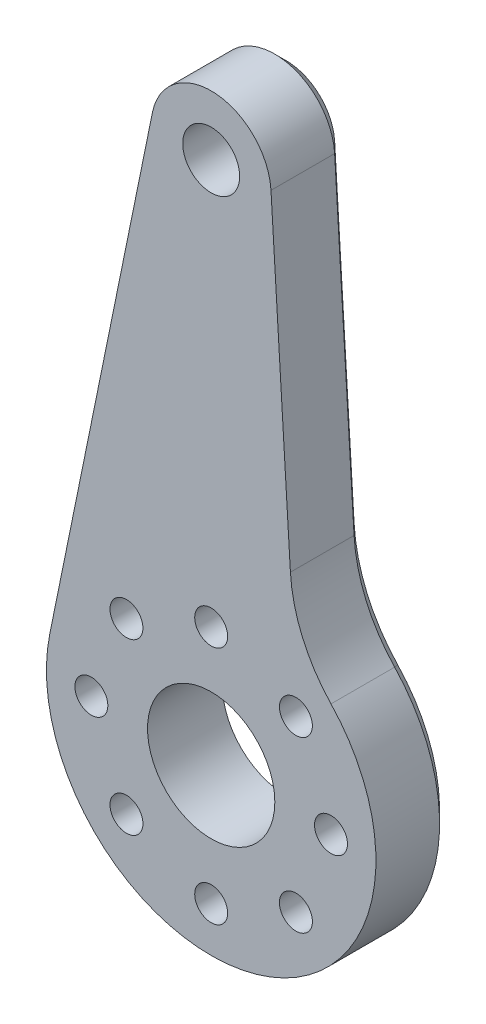
ISO-10303-21;
HEADER;
FILE_DESCRIPTION(('STEP AP214'),'2;1');
FILE_NAME('part.step','',(''),(''),'','','');
FILE_SCHEMA(('AUTOMOTIVE_DESIGN { 1 0 10303 214 1 1 1 1 }'));
ENDSEC;
DATA;
#1=APPLICATION_CONTEXT('core data for automotive mechanical design processes');
#2=APPLICATION_PROTOCOL_DEFINITION('international standard','automotive_design',2000,#1);
#3=PRODUCT_CONTEXT('',#1,'mechanical');
#4=PRODUCT('Part','Part','',(#3));
#5=PRODUCT_RELATED_PRODUCT_CATEGORY('part','',(#4));
#6=PRODUCT_DEFINITION_FORMATION('','',#4);
#7=PRODUCT_DEFINITION_CONTEXT('part definition',#1,'design');
#8=PRODUCT_DEFINITION('design','',#6,#7);
#9=PRODUCT_DEFINITION_SHAPE('','',#8);
#10=(LENGTH_UNIT() NAMED_UNIT(*) SI_UNIT(.MILLI.,.METRE.));
#11=(NAMED_UNIT(*) PLANE_ANGLE_UNIT() SI_UNIT($,.RADIAN.));
#12=(NAMED_UNIT(*) SI_UNIT($,.STERADIAN.) SOLID_ANGLE_UNIT());
#13=UNCERTAINTY_MEASURE_WITH_UNIT(LENGTH_MEASURE(1.E-05),#10,'distance_accuracy_value','');
#14=(GEOMETRIC_REPRESENTATION_CONTEXT(3) GLOBAL_UNCERTAINTY_ASSIGNED_CONTEXT((#13)) GLOBAL_UNIT_ASSIGNED_CONTEXT((#10,
#11,#12)) REPRESENTATION_CONTEXT('',''));
#15=CARTESIAN_POINT('',(0.,0.,0.));
#16=DIRECTION('',(0.,0.,1.));
#17=DIRECTION('',(1.,0.,0.));
#18=AXIS2_PLACEMENT_3D('',#15,#16,#17);
#19=CARTESIAN_POINT('',(-6.935866144815,-20.6239036018759,5.));
#20=DIRECTION('',(0.,0.,-1.));
#21=DIRECTION('',(-1.,0.,0.));
#22=AXIS2_PLACEMENT_3D('',#19,#20,#21);
#23=CYLINDRICAL_SURFACE('',#22,1.1);
#24=CARTESIAN_POINT('',(-6.935866144815,-20.6239036018759,5.));
#25=DIRECTION('',(0.,0.,1.));
#26=DIRECTION('',(1.,0.,0.));
#27=AXIS2_PLACEMENT_3D('',#24,#25,#26);
#28=CIRCLE('',#27,1.1);
#29=CARTESIAN_POINT('',(-5.835866144815,-20.6239036018759,5.));
#30=VERTEX_POINT('',#29);
#31=EDGE_CURVE('E227',#30,#30,#28,.T.);
#32=ORIENTED_EDGE('',*,*,#31,.T.);
#33=EDGE_LOOP('',(#32));
#34=FACE_BOUND('',#33,.T.);
#35=CARTESIAN_POINT('',(-6.935866144815,-20.6239036018759,2.25));
#36=DIRECTION('',(0.,0.,-1.));
#37=DIRECTION('',(-1.,0.,0.));
#38=AXIS2_PLACEMENT_3D('',#35,#36,#37);
#39=CIRCLE('',#38,1.1);
#40=CARTESIAN_POINT('',(-8.035866144815,-20.6239036018759,2.25));
#41=VERTEX_POINT('',#40);
#42=EDGE_CURVE('E203',#41,#41,#39,.T.);
#43=ORIENTED_EDGE('',*,*,#42,.T.);
#44=EDGE_LOOP('',(#43));
#45=FACE_BOUND('',#44,.T.);
#46=ADVANCED_FACE('F39',(#34,#45),#23,.F.);
#47=CARTESIAN_POINT('',(-9.27901189532261,-26.2807578513683,5.));
#48=DIRECTION('',(0.,0.,-1.));
#49=DIRECTION('',(-1.,0.,0.));
#50=AXIS2_PLACEMENT_3D('',#47,#48,#49);
#51=CYLINDRICAL_SURFACE('',#50,1.1);
#52=CARTESIAN_POINT('',(-9.27901189532261,-26.2807578513683,5.));
#53=DIRECTION('',(0.,0.,1.));
#54=DIRECTION('',(1.,0.,0.));
#55=AXIS2_PLACEMENT_3D('',#52,#53,#54);
#56=CIRCLE('',#55,1.1);
#57=CARTESIAN_POINT('',(-8.17901189532261,-26.2807578513683,5.));
#58=VERTEX_POINT('',#57);
#59=EDGE_CURVE('E223',#58,#58,#56,.T.);
#60=ORIENTED_EDGE('',*,*,#59,.T.);
#61=EDGE_LOOP('',(#60));
#62=FACE_BOUND('',#61,.T.);
#63=CARTESIAN_POINT('',(-9.27901189532261,-26.2807578513683,2.25));
#64=DIRECTION('',(0.,0.,-1.));
#65=DIRECTION('',(-1.,0.,0.));
#66=AXIS2_PLACEMENT_3D('',#63,#64,#65);
#67=CIRCLE('',#66,1.1);
#68=CARTESIAN_POINT('',(-10.3790118953226,-26.2807578513683,2.25));
#69=VERTEX_POINT('',#68);
#70=EDGE_CURVE('E280',#69,#69,#67,.T.);
#71=ORIENTED_EDGE('',*,*,#70,.T.);
#72=EDGE_LOOP('',(#71));
#73=FACE_BOUND('',#72,.T.);
#74=ADVANCED_FACE('F402',(#62,#73),#51,.F.);
#75=CARTESIAN_POINT('',(-14.935866144815,-28.6239036018759,5.));
#76=DIRECTION('',(0.,0.,-1.));
#77=DIRECTION('',(-1.,0.,0.));
#78=AXIS2_PLACEMENT_3D('',#75,#76,#77);
#79=CYLINDRICAL_SURFACE('',#78,1.1);
#80=CARTESIAN_POINT('',(-14.935866144815,-28.6239036018759,5.));
#81=DIRECTION('',(0.,0.,1.));
#82=DIRECTION('',(1.,0.,0.));
#83=AXIS2_PLACEMENT_3D('',#80,#81,#82);
#84=CIRCLE('',#83,1.1);
#85=CARTESIAN_POINT('',(-13.835866144815,-28.6239036018759,5.));
#86=VERTEX_POINT('',#85);
#87=EDGE_CURVE('E219',#86,#86,#84,.T.);
#88=ORIENTED_EDGE('',*,*,#87,.T.);
#89=EDGE_LOOP('',(#88));
#90=FACE_BOUND('',#89,.T.);
#91=CARTESIAN_POINT('',(-14.935866144815,-28.6239036018759,2.25));
#92=DIRECTION('',(0.,0.,-1.));
#93=DIRECTION('',(-1.,0.,0.));
#94=AXIS2_PLACEMENT_3D('',#91,#92,#93);
#95=CIRCLE('',#94,1.1);
#96=CARTESIAN_POINT('',(-16.035866144815,-28.6239036018759,2.25));
#97=VERTEX_POINT('',#96);
#98=EDGE_CURVE('E276',#97,#97,#95,.T.);
#99=ORIENTED_EDGE('',*,*,#98,.T.);
#100=EDGE_LOOP('',(#99));
#101=FACE_BOUND('',#100,.T.);
#102=ADVANCED_FACE('F407',(#90,#101),#79,.F.);
#103=CARTESIAN_POINT('',(-20.5927203943074,-26.2807578513683,5.));
#104=DIRECTION('',(0.,0.,-1.));
#105=DIRECTION('',(-1.,0.,0.));
#106=AXIS2_PLACEMENT_3D('',#103,#104,#105);
#107=CYLINDRICAL_SURFACE('',#106,1.1);
#108=CARTESIAN_POINT('',(-20.5927203943074,-26.2807578513683,5.));
#109=DIRECTION('',(0.,0.,1.));
#110=DIRECTION('',(1.,0.,0.));
#111=AXIS2_PLACEMENT_3D('',#108,#109,#110);
#112=CIRCLE('',#111,1.1);
#113=CARTESIAN_POINT('',(-19.4927203943074,-26.2807578513683,5.));
#114=VERTEX_POINT('',#113);
#115=EDGE_CURVE('E215',#114,#114,#112,.T.);
#116=ORIENTED_EDGE('',*,*,#115,.T.);
#117=EDGE_LOOP('',(#116));
#118=FACE_BOUND('',#117,.T.);
#119=CARTESIAN_POINT('',(-20.5927203943074,-26.2807578513683,2.25));
#120=DIRECTION('',(0.,0.,-1.));
#121=DIRECTION('',(-1.,0.,0.));
#122=AXIS2_PLACEMENT_3D('',#119,#120,#121);
#123=CIRCLE('',#122,1.1);
#124=CARTESIAN_POINT('',(-21.6927203943074,-26.2807578513683,2.25));
#125=VERTEX_POINT('',#124);
#126=EDGE_CURVE('E272',#125,#125,#123,.T.);
#127=ORIENTED_EDGE('',*,*,#126,.T.);
#128=EDGE_LOOP('',(#127));
#129=FACE_BOUND('',#128,.T.);
#130=ADVANCED_FACE('F414',(#118,#129),#107,.F.);
#131=CARTESIAN_POINT('',(-22.935866144815,-20.6239036018759,5.));
#132=DIRECTION('',(0.,0.,-1.));
#133=DIRECTION('',(-1.,0.,0.));
#134=AXIS2_PLACEMENT_3D('',#131,#132,#133);
#135=CYLINDRICAL_SURFACE('',#134,1.1);
#136=CARTESIAN_POINT('',(-22.935866144815,-20.6239036018759,5.));
#137=DIRECTION('',(0.,0.,1.));
#138=DIRECTION('',(1.,0.,0.));
#139=AXIS2_PLACEMENT_3D('',#136,#137,#138);
#140=CIRCLE('',#139,1.1);
#141=CARTESIAN_POINT('',(-21.835866144815,-20.6239036018759,5.));
#142=VERTEX_POINT('',#141);
#143=EDGE_CURVE('E211',#142,#142,#140,.T.);
#144=ORIENTED_EDGE('',*,*,#143,.T.);
#145=EDGE_LOOP('',(#144));
#146=FACE_BOUND('',#145,.T.);
#147=CARTESIAN_POINT('',(-22.935866144815,-20.6239036018759,2.25));
#148=DIRECTION('',(0.,0.,-1.));
#149=DIRECTION('',(-1.,0.,0.));
#150=AXIS2_PLACEMENT_3D('',#147,#148,#149);
#151=CIRCLE('',#150,1.1);
#152=CARTESIAN_POINT('',(-24.035866144815,-20.6239036018759,2.25));
#153=VERTEX_POINT('',#152);
#154=EDGE_CURVE('E268',#153,#153,#151,.T.);
#155=ORIENTED_EDGE('',*,*,#154,.T.);
#156=EDGE_LOOP('',(#155));
#157=FACE_BOUND('',#156,.T.);
#158=ADVANCED_FACE('F418',(#146,#157),#135,.F.);
#159=CARTESIAN_POINT('',(-20.5927203943074,-14.9670493523836,5.));
#160=DIRECTION('',(0.,0.,-1.));
#161=DIRECTION('',(-1.,0.,0.));
#162=AXIS2_PLACEMENT_3D('',#159,#160,#161);
#163=CYLINDRICAL_SURFACE('',#162,1.1);
#164=CARTESIAN_POINT('',(-20.5927203943074,-14.9670493523836,5.));
#165=DIRECTION('',(0.,0.,1.));
#166=DIRECTION('',(1.,0.,0.));
#167=AXIS2_PLACEMENT_3D('',#164,#165,#166);
#168=CIRCLE('',#167,1.1);
#169=CARTESIAN_POINT('',(-19.4927203943074,-14.9670493523836,5.));
#170=VERTEX_POINT('',#169);
#171=EDGE_CURVE('E207',#170,#170,#168,.T.);
#172=ORIENTED_EDGE('',*,*,#171,.T.);
#173=EDGE_LOOP('',(#172));
#174=FACE_BOUND('',#173,.T.);
#175=CARTESIAN_POINT('',(-20.5927203943074,-14.9670493523836,2.25));
#176=DIRECTION('',(0.,0.,-1.));
#177=DIRECTION('',(-1.,0.,0.));
#178=AXIS2_PLACEMENT_3D('',#175,#176,#177);
#179=CIRCLE('',#178,1.1);
#180=CARTESIAN_POINT('',(-21.6927203943074,-14.9670493523836,2.25));
#181=VERTEX_POINT('',#180);
#182=EDGE_CURVE('E264',#181,#181,#179,.T.);
#183=ORIENTED_EDGE('',*,*,#182,.T.);
#184=EDGE_LOOP('',(#183));
#185=FACE_BOUND('',#184,.T.);
#186=ADVANCED_FACE('F422',(#174,#185),#163,.F.);
#187=CARTESIAN_POINT('',(-14.935866144815,-12.6239036018759,5.));
#188=DIRECTION('',(0.,0.,-1.));
#189=DIRECTION('',(-1.,0.,0.));
#190=AXIS2_PLACEMENT_3D('',#187,#188,#189);
#191=CYLINDRICAL_SURFACE('',#190,1.1);
#192=CARTESIAN_POINT('',(-14.935866144815,-12.6239036018759,5.));
#193=DIRECTION('',(0.,0.,1.));
#194=DIRECTION('',(1.,0.,0.));
#195=AXIS2_PLACEMENT_3D('',#192,#193,#194);
#196=CIRCLE('',#195,1.1);
#197=CARTESIAN_POINT('',(-13.835866144815,-12.6239036018759,5.));
#198=VERTEX_POINT('',#197);
#199=EDGE_CURVE('E202',#198,#198,#196,.T.);
#200=ORIENTED_EDGE('',*,*,#199,.T.);
#201=EDGE_LOOP('',(#200));
#202=FACE_BOUND('',#201,.T.);
#203=CARTESIAN_POINT('',(-14.935866144815,-12.6239036018759,2.25));
#204=DIRECTION('',(0.,0.,-1.));
#205=DIRECTION('',(-1.,0.,0.));
#206=AXIS2_PLACEMENT_3D('',#203,#204,#205);
#207=CIRCLE('',#206,1.1);
#208=CARTESIAN_POINT('',(-16.035866144815,-12.6239036018759,2.25));
#209=VERTEX_POINT('',#208);
#210=EDGE_CURVE('E260',#209,#209,#207,.T.);
#211=ORIENTED_EDGE('',*,*,#210,.T.);
#212=EDGE_LOOP('',(#211));
#213=FACE_BOUND('',#212,.T.);
#214=ADVANCED_FACE('F426',(#202,#213),#191,.F.);
#215=CARTESIAN_POINT('',(-9.27901189532263,-14.9670493523835,5.));
#216=DIRECTION('',(0.,0.,-1.));
#217=DIRECTION('',(-1.,0.,0.));
#218=AXIS2_PLACEMENT_3D('',#215,#216,#217);
#219=CYLINDRICAL_SURFACE('',#218,1.1);
#220=CARTESIAN_POINT('',(-9.27901189532263,-14.9670493523835,5.));
#221=DIRECTION('',(0.,0.,1.));
#222=DIRECTION('',(1.,0.,0.));
#223=AXIS2_PLACEMENT_3D('',#220,#221,#222);
#224=CIRCLE('',#223,1.1);
#225=CARTESIAN_POINT('',(-8.17901189532263,-14.9670493523835,5.));
#226=VERTEX_POINT('',#225);
#227=EDGE_CURVE('E198',#226,#226,#224,.T.);
#228=ORIENTED_EDGE('',*,*,#227,.T.);
#229=EDGE_LOOP('',(#228));
#230=FACE_BOUND('',#229,.T.);
#231=CARTESIAN_POINT('',(-9.27901189532263,-14.9670493523835,2.25));
#232=DIRECTION('',(0.,0.,-1.));
#233=DIRECTION('',(-1.,0.,0.));
#234=AXIS2_PLACEMENT_3D('',#231,#232,#233);
#235=CIRCLE('',#234,1.1);
#236=CARTESIAN_POINT('',(-10.3790118953226,-14.9670493523835,2.25));
#237=VERTEX_POINT('',#236);
#238=EDGE_CURVE('E194',#237,#237,#235,.T.);
#239=ORIENTED_EDGE('',*,*,#238,.T.);
#240=EDGE_LOOP('',(#239));
#241=FACE_BOUND('',#240,.T.);
#242=ADVANCED_FACE('F430',(#230,#241),#219,.F.);
#243=CARTESIAN_POINT('',(-14.935866144815,14.3760963981241,5.));
#244=DIRECTION('',(0.,0.,1.));
#245=DIRECTION('',(1.,0.,0.));
#246=AXIS2_PLACEMENT_3D('',#243,#244,#245);
#247=PLANE('',#246);
#248=DIRECTION('',(0.0604046732284117,-0.99817397053428,0.));
#249=VECTOR('',#248,1.);
#250=CARTESIAN_POINT('',(-10.9431702626779,14.6177150910377,5.));
#251=LINE('',#250,#249);
#252=CARTESIAN_POINT('',(-10.9431702626779,14.6177150910377,5.));
#253=VERTEX_POINT('',#252);
#254=CARTESIAN_POINT('',(-9.64627784771592,-6.81314748979778,5.));
#255=VERTEX_POINT('',#254);
#256=EDGE_CURVE('E119',#253,#255,#251,.T.);
#257=ORIENTED_EDGE('',*,*,#256,.F.);
#258=CARTESIAN_POINT('',(-14.935866144815,14.3760963981241,5.));
#259=DIRECTION('',(0.,0.,1.));
#260=DIRECTION('',(1.,0.,0.));
#261=AXIS2_PLACEMENT_3D('',#258,#259,#260);
#262=CIRCLE('',#261,4.);
#263=CARTESIAN_POINT('',(-18.8550497332681,15.1760963981241,5.));
#264=VERTEX_POINT('',#263);
#265=EDGE_CURVE('E103',#253,#264,#262,.T.);
#266=ORIENTED_EDGE('',*,*,#265,.T.);
#267=DIRECTION('',(-0.2,-0.979795897113271,0.));
#268=VECTOR('',#267,1.);
#269=CARTESIAN_POINT('',(-18.8550497332681,15.1760963981241,5.));
#270=LINE('',#269,#268);
#271=CARTESIAN_POINT('',(-25.713621013061,-18.4239036018759,5.));
#272=VERTEX_POINT('',#271);
#273=EDGE_CURVE('E111',#264,#272,#270,.T.);
#274=ORIENTED_EDGE('',*,*,#273,.T.);
#275=CARTESIAN_POINT('',(-14.935866144815,-20.6239036018759,5.));
#276=DIRECTION('',(0.,0.,1.));
#277=DIRECTION('',(1.,0.,0.));
#278=AXIS2_PLACEMENT_3D('',#275,#276,#277);
#279=CIRCLE('',#278,11.);
#280=CARTESIAN_POINT('',(-6.93659909591687,-13.0732925881624,5.));
#281=VERTEX_POINT('',#280);
#282=EDGE_CURVE('E248',#272,#281,#279,.T.);
#283=ORIENTED_EDGE('',*,*,#282,.T.);
#284=CARTESIAN_POINT('',(0.335461857626873,-6.20910075751366,5.));
#285=DIRECTION('',(0.,0.,1.));
#286=DIRECTION('',(1.,0.,0.));
#287=AXIS2_PLACEMENT_3D('',#284,#285,#286);
#288=CIRCLE('',#287,10.);
#289=EDGE_CURVE('E129',#281,#255,#288,.F.);
#290=ORIENTED_EDGE('',*,*,#289,.T.);
#291=EDGE_LOOP('',(#257,#266,#274,#283,#290));
#292=FACE_BOUND('',#291,.T.);
#293=ORIENTED_EDGE('',*,*,#199,.F.);
#294=EDGE_LOOP('',(#293));
#295=FACE_BOUND('',#294,.T.);
#296=ORIENTED_EDGE('',*,*,#143,.F.);
#297=EDGE_LOOP('',(#296));
#298=FACE_BOUND('',#297,.T.);
#299=ORIENTED_EDGE('',*,*,#87,.F.);
#300=EDGE_LOOP('',(#299));
#301=FACE_BOUND('',#300,.T.);
#302=ORIENTED_EDGE('',*,*,#31,.F.);
#303=EDGE_LOOP('',(#302));
#304=FACE_BOUND('',#303,.T.);
#305=CARTESIAN_POINT('',(-14.935866144815,14.3760963981241,5.));
#306=DIRECTION('',(0.,0.,1.));
#307=DIRECTION('',(1.,0.,0.));
#308=AXIS2_PLACEMENT_3D('',#305,#306,#307);
#309=CIRCLE('',#308,1.9);
#310=CARTESIAN_POINT('',(-13.035866144815,14.3760963981241,5.));
#311=VERTEX_POINT('',#310);
#312=EDGE_CURVE('E112',#311,#311,#309,.T.);
#313=ORIENTED_EDGE('',*,*,#312,.F.);
#314=EDGE_LOOP('',(#313));
#315=FACE_BOUND('',#314,.T.);
#316=CARTESIAN_POINT('',(-14.935866144815,-20.6239036018759,5.));
#317=DIRECTION('',(0.,0.,1.));
#318=DIRECTION('',(1.,0.,0.));
#319=AXIS2_PLACEMENT_3D('',#316,#317,#318);
#320=CIRCLE('',#319,4.25);
#321=CARTESIAN_POINT('',(-10.685866144815,-20.6239036018759,5.));
#322=VERTEX_POINT('',#321);
#323=EDGE_CURVE('E232',#322,#322,#320,.T.);
#324=ORIENTED_EDGE('',*,*,#323,.F.);
#325=EDGE_LOOP('',(#324));
#326=FACE_BOUND('',#325,.T.);
#327=ORIENTED_EDGE('',*,*,#59,.F.);
#328=EDGE_LOOP('',(#327));
#329=FACE_BOUND('',#328,.T.);
#330=ORIENTED_EDGE('',*,*,#115,.F.);
#331=EDGE_LOOP('',(#330));
#332=FACE_BOUND('',#331,.T.);
#333=ORIENTED_EDGE('',*,*,#171,.F.);
#334=EDGE_LOOP('',(#333));
#335=FACE_BOUND('',#334,.T.);
#336=ORIENTED_EDGE('',*,*,#227,.F.);
#337=EDGE_LOOP('',(#336));
#338=FACE_BOUND('',#337,.T.);
#339=ADVANCED_FACE('F125',(#292,#295,#298,#301,#304,#315,#326,#329,#332,#335,#338),#247,.T.);
#340=CARTESIAN_POINT('',(-14.935866144815,14.3760963981241,0.));
#341=DIRECTION('',(0.,0.,1.));
#342=DIRECTION('',(1.,0.,0.));
#343=AXIS2_PLACEMENT_3D('',#340,#341,#342);
#344=PLANE('',#343);
#345=CARTESIAN_POINT('',(-14.935866144815,14.3760963981241,0.));
#346=DIRECTION('',(0.,0.,1.));
#347=DIRECTION('',(1.,0.,0.));
#348=AXIS2_PLACEMENT_3D('',#345,#346,#347);
#349=CIRCLE('',#348,3.25000000000001);
#350=CARTESIAN_POINT('',(-18.1202028104331,15.0260963981241,0.));
#351=VERTEX_POINT('',#350);
#352=CARTESIAN_POINT('',(-11.6918007405786,14.5724115861164,0.));
#353=VERTEX_POINT('',#352);
#354=EDGE_CURVE('E302',#351,#353,#349,.F.);
#355=ORIENTED_EDGE('',*,*,#354,.T.);
#356=DIRECTION('',(0.0604046732284117,-0.99817397053428,0.));
#357=VECTOR('',#356,1.);
#358=CARTESIAN_POINT('',(-11.6918007405786,14.5724115861164,0.));
#359=LINE('',#358,#357);
#360=CARTESIAN_POINT('',(-10.3949083256166,-6.85845099471908,0.));
#361=VERTEX_POINT('',#360);
#362=EDGE_CURVE('E308',#353,#361,#359,.T.);
#363=ORIENTED_EDGE('',*,*,#362,.T.);
#364=CARTESIAN_POINT('',(0.335461857626873,-6.20910075751366,0.));
#365=DIRECTION('',(0.,0.,1.));
#366=DIRECTION('',(1.,0.,0.));
#367=AXIS2_PLACEMENT_3D('',#364,#365,#366);
#368=CIRCLE('',#367,10.75);
#369=CARTESIAN_POINT('',(-7.48200366743265,-13.588106975461,0.));
#370=VERTEX_POINT('',#369);
#371=EDGE_CURVE('E305',#361,#370,#368,.T.);
#372=ORIENTED_EDGE('',*,*,#371,.T.);
#373=CARTESIAN_POINT('',(-14.935866144815,-20.6239036018759,0.));
#374=DIRECTION('',(0.,0.,1.));
#375=DIRECTION('',(1.,0.,0.));
#376=AXIS2_PLACEMENT_3D('',#373,#374,#375);
#377=CIRCLE('',#376,10.25);
#378=CARTESIAN_POINT('',(-24.978774090226,-18.5739036018759,0.));
#379=VERTEX_POINT('',#378);
#380=EDGE_CURVE('E299',#370,#379,#377,.F.);
#381=ORIENTED_EDGE('',*,*,#380,.T.);
#382=DIRECTION('',(0.2,0.979795897113271,0.));
#383=VECTOR('',#382,1.);
#384=CARTESIAN_POINT('',(-18.1202028104331,15.0260963981241,0.));
#385=LINE('',#384,#383);
#386=EDGE_CURVE('E296',#379,#351,#385,.T.);
#387=ORIENTED_EDGE('',*,*,#386,.T.);
#388=EDGE_LOOP('',(#355,#363,#372,#381,#387));
#389=FACE_BOUND('',#388,.T.);
#390=CARTESIAN_POINT('',(-20.5927203943074,-14.9670493523835,0.));
#391=DIRECTION('',(0.,0.,-1.));
#392=DIRECTION('',(-1.,0.,0.));
#393=AXIS2_PLACEMENT_3D('',#390,#391,#392);
#394=CIRCLE('',#393,1.75);
#395=CARTESIAN_POINT('',(-22.3427203943074,-14.9670493523835,0.));
#396=VERTEX_POINT('',#395);
#397=EDGE_CURVE('E131',#396,#396,#394,.T.);
#398=ORIENTED_EDGE('',*,*,#397,.F.);
#399=EDGE_LOOP('',(#398));
#400=FACE_BOUND('',#399,.T.);
#401=CARTESIAN_POINT('',(-14.935866144815,-12.6239036018759,0.));
#402=DIRECTION('',(0.,0.,-1.));
#403=DIRECTION('',(-1.,0.,0.));
#404=AXIS2_PLACEMENT_3D('',#401,#402,#403);
#405=CIRCLE('',#404,1.75);
#406=CARTESIAN_POINT('',(-16.685866144815,-12.6239036018759,0.));
#407=VERTEX_POINT('',#406);
#408=EDGE_CURVE('E183',#407,#407,#405,.T.);
#409=ORIENTED_EDGE('',*,*,#408,.F.);
#410=EDGE_LOOP('',(#409));
#411=FACE_BOUND('',#410,.T.);
#412=CARTESIAN_POINT('',(-9.27901189532261,-14.9670493523836,0.));
#413=DIRECTION('',(0.,0.,-1.));
#414=DIRECTION('',(-1.,0.,0.));
#415=AXIS2_PLACEMENT_3D('',#412,#413,#414);
#416=CIRCLE('',#415,1.75);
#417=CARTESIAN_POINT('',(-11.0290118953226,-14.9670493523836,0.));
#418=VERTEX_POINT('',#417);
#419=EDGE_CURVE('E175',#418,#418,#416,.T.);
#420=ORIENTED_EDGE('',*,*,#419,.F.);
#421=EDGE_LOOP('',(#420));
#422=FACE_BOUND('',#421,.T.);
#423=CARTESIAN_POINT('',(-6.935866144815,-20.6239036018759,0.));
#424=DIRECTION('',(0.,0.,-1.));
#425=DIRECTION('',(-1.,0.,0.));
#426=AXIS2_PLACEMENT_3D('',#423,#424,#425);
#427=CIRCLE('',#426,1.75);
#428=CARTESIAN_POINT('',(-8.685866144815,-20.6239036018759,0.));
#429=VERTEX_POINT('',#428);
#430=EDGE_CURVE('E167',#429,#429,#427,.T.);
#431=ORIENTED_EDGE('',*,*,#430,.F.);
#432=EDGE_LOOP('',(#431));
#433=FACE_BOUND('',#432,.T.);
#434=CARTESIAN_POINT('',(-9.27901189532261,-26.2807578513683,0.));
#435=DIRECTION('',(0.,0.,-1.));
#436=DIRECTION('',(-1.,0.,0.));
#437=AXIS2_PLACEMENT_3D('',#434,#435,#436);
#438=CIRCLE('',#437,1.75);
#439=CARTESIAN_POINT('',(-11.0290118953226,-26.2807578513683,0.));
#440=VERTEX_POINT('',#439);
#441=EDGE_CURVE('E159',#440,#440,#438,.T.);
#442=ORIENTED_EDGE('',*,*,#441,.F.);
#443=EDGE_LOOP('',(#442));
#444=FACE_BOUND('',#443,.T.);
#445=CARTESIAN_POINT('',(-14.935866144815,-28.6239036018759,0.));
#446=DIRECTION('',(0.,0.,-1.));
#447=DIRECTION('',(-1.,0.,0.));
#448=AXIS2_PLACEMENT_3D('',#445,#446,#447);
#449=CIRCLE('',#448,1.75);
#450=CARTESIAN_POINT('',(-16.685866144815,-28.6239036018759,0.));
#451=VERTEX_POINT('',#450);
#452=EDGE_CURVE('E151',#451,#451,#449,.T.);
#453=ORIENTED_EDGE('',*,*,#452,.F.);
#454=EDGE_LOOP('',(#453));
#455=FACE_BOUND('',#454,.T.);
#456=CARTESIAN_POINT('',(-20.5927203943074,-26.2807578513683,0.));
#457=DIRECTION('',(0.,0.,-1.));
#458=DIRECTION('',(-1.,0.,0.));
#459=AXIS2_PLACEMENT_3D('',#456,#457,#458);
#460=CIRCLE('',#459,1.74999999999999);
#461=CARTESIAN_POINT('',(-22.3427203943074,-26.2807578513683,0.));
#462=VERTEX_POINT('',#461);
#463=EDGE_CURVE('E143',#462,#462,#460,.T.);
#464=ORIENTED_EDGE('',*,*,#463,.F.);
#465=EDGE_LOOP('',(#464));
#466=FACE_BOUND('',#465,.T.);
#467=CARTESIAN_POINT('',(-22.935866144815,-20.6239036018759,0.));
#468=DIRECTION('',(0.,0.,-1.));
#469=DIRECTION('',(-1.,0.,0.));
#470=AXIS2_PLACEMENT_3D('',#467,#468,#469);
#471=CIRCLE('',#470,1.75);
#472=CARTESIAN_POINT('',(-24.685866144815,-20.6239036018759,0.));
#473=VERTEX_POINT('',#472);
#474=EDGE_CURVE('E142',#473,#473,#471,.T.);
#475=ORIENTED_EDGE('',*,*,#474,.F.);
#476=EDGE_LOOP('',(#475));
#477=FACE_BOUND('',#476,.T.);
#478=CARTESIAN_POINT('',(-14.935866144815,14.3760963981241,0.));
#479=DIRECTION('',(0.,0.,1.));
#480=DIRECTION('',(1.,0.,0.));
#481=AXIS2_PLACEMENT_3D('',#478,#479,#480);
#482=CIRCLE('',#481,1.9);
#483=CARTESIAN_POINT('',(-13.035866144815,14.3760963981241,0.));
#484=VERTEX_POINT('',#483);
#485=EDGE_CURVE('E236',#484,#484,#482,.T.);
#486=ORIENTED_EDGE('',*,*,#485,.T.);
#487=EDGE_LOOP('',(#486));
#488=FACE_BOUND('',#487,.T.);
#489=CARTESIAN_POINT('',(-14.935866144815,-20.6239036018759,0.));
#490=DIRECTION('',(0.,0.,1.));
#491=DIRECTION('',(1.,0.,0.));
#492=AXIS2_PLACEMENT_3D('',#489,#490,#491);
#493=CIRCLE('',#492,4.25);
#494=CARTESIAN_POINT('',(-10.685866144815,-20.6239036018759,0.));
#495=VERTEX_POINT('',#494);
#496=EDGE_CURVE('E231',#495,#495,#493,.T.);
#497=ORIENTED_EDGE('',*,*,#496,.T.);
#498=EDGE_LOOP('',(#497));
#499=FACE_BOUND('',#498,.T.);
#500=ADVANCED_FACE('F361',(#389,#400,#411,#422,#433,#444,#455,#466,#477,#488,#499),#344,.F.);
#501=CARTESIAN_POINT('',(-14.935866144815,14.3760963981241,5.));
#502=DIRECTION('',(0.,0.,-1.));
#503=DIRECTION('',(-1.,0.,0.));
#504=AXIS2_PLACEMENT_3D('',#501,#502,#503);
#505=CYLINDRICAL_SURFACE('',#504,4.);
#506=DIRECTION('',(0.,0.,-1.));
#507=VECTOR('',#506,1.);
#508=CARTESIAN_POINT('',(-10.9431702626779,14.6177150910377,10.));
#509=LINE('',#508,#507);
#510=CARTESIAN_POINT('',(-10.9431702626779,14.6177150910377,0.750000000000001));
#511=VERTEX_POINT('',#510);
#512=EDGE_CURVE('E106',#253,#511,#509,.T.);
#513=ORIENTED_EDGE('',*,*,#512,.T.);
#514=CARTESIAN_POINT('',(-14.935866144815,14.3760963981241,0.750000000000001));
#515=DIRECTION('',(0.,0.,1.));
#516=DIRECTION('',(1.,0.,0.));
#517=AXIS2_PLACEMENT_3D('',#514,#515,#516);
#518=CIRCLE('',#517,4.);
#519=CARTESIAN_POINT('',(-18.8550497332681,15.1760963981241,0.750000000000001));
#520=VERTEX_POINT('',#519);
#521=EDGE_CURVE('E63',#511,#520,#518,.T.);
#522=ORIENTED_EDGE('',*,*,#521,.T.);
#523=DIRECTION('',(0.,0.,-1.));
#524=VECTOR('',#523,1.);
#525=CARTESIAN_POINT('',(-18.8550497332681,15.1760963981241,5.));
#526=LINE('',#525,#524);
#527=EDGE_CURVE('E107',#264,#520,#526,.T.);
#528=ORIENTED_EDGE('',*,*,#527,.F.);
#529=ORIENTED_EDGE('',*,*,#265,.F.);
#530=EDGE_LOOP('',(#513,#522,#528,#529));
#531=FACE_BOUND('',#530,.T.);
#532=ADVANCED_FACE('F105',(#531),#505,.T.);
#533=CARTESIAN_POINT('',(-18.8550497332681,15.1760963981241,5.));
#534=DIRECTION('',(0.979795897113271,-0.2,0.));
#535=DIRECTION('',(0.2,0.979795897113271,0.));
#536=AXIS2_PLACEMENT_3D('',#533,#534,#535);
#537=PLANE('',#536);
#538=ORIENTED_EDGE('',*,*,#527,.T.);
#539=DIRECTION('',(-0.2,-0.979795897113271,0.));
#540=VECTOR('',#539,1.);
#541=CARTESIAN_POINT('',(-18.8550497332681,15.1760963981241,0.750000000000001));
#542=LINE('',#541,#540);
#543=CARTESIAN_POINT('',(-25.713621013061,-18.4239036018759,0.750000000000001));
#544=VERTEX_POINT('',#543);
#545=EDGE_CURVE('E11',#520,#544,#542,.T.);
#546=ORIENTED_EDGE('',*,*,#545,.T.);
#547=DIRECTION('',(0.,0.,-1.));
#548=VECTOR('',#547,1.);
#549=CARTESIAN_POINT('',(-25.713621013061,-18.4239036018759,5.));
#550=LINE('',#549,#548);
#551=EDGE_CURVE('E251',#272,#544,#550,.T.);
#552=ORIENTED_EDGE('',*,*,#551,.F.);
#553=ORIENTED_EDGE('',*,*,#273,.F.);
#554=EDGE_LOOP('',(#538,#546,#552,#553));
#555=FACE_BOUND('',#554,.T.);
#556=ADVANCED_FACE('F556',(#555),#537,.F.);
#557=CARTESIAN_POINT('',(-14.935866144815,-20.6239036018759,5.));
#558=DIRECTION('',(0.,0.,-1.));
#559=DIRECTION('',(-1.,0.,0.));
#560=AXIS2_PLACEMENT_3D('',#557,#558,#559);
#561=CYLINDRICAL_SURFACE('',#560,11.);
#562=ORIENTED_EDGE('',*,*,#551,.T.);
#563=CARTESIAN_POINT('',(-14.935866144815,-20.6239036018759,0.750000000000001));
#564=DIRECTION('',(0.,0.,1.));
#565=DIRECTION('',(1.,0.,0.));
#566=AXIS2_PLACEMENT_3D('',#563,#564,#565);
#567=CIRCLE('',#566,11.);
#568=CARTESIAN_POINT('',(-6.93659909591687,-13.0732925881624,0.750000000000001));
#569=VERTEX_POINT('',#568);
#570=EDGE_CURVE('E49',#544,#569,#567,.T.);
#571=ORIENTED_EDGE('',*,*,#570,.T.);
#572=DIRECTION('',(0.,0.,-1.));
#573=VECTOR('',#572,1.);
#574=CARTESIAN_POINT('',(-6.93659909591687,-13.0732925881624,5.));
#575=LINE('',#574,#573);
#576=EDGE_CURVE('E289',#569,#281,#575,.F.);
#577=ORIENTED_EDGE('',*,*,#576,.T.);
#578=ORIENTED_EDGE('',*,*,#282,.F.);
#579=EDGE_LOOP('',(#562,#571,#577,#578));
#580=FACE_BOUND('',#579,.T.);
#581=ADVANCED_FACE('F347',(#580),#561,.T.);
#582=CARTESIAN_POINT('',(-14.935866144815,14.3760963981241,5.));
#583=DIRECTION('',(0.,0.,-1.));
#584=DIRECTION('',(-1.,0.,0.));
#585=AXIS2_PLACEMENT_3D('',#582,#583,#584);
#586=CYLINDRICAL_SURFACE('',#585,1.9);
#587=ORIENTED_EDGE('',*,*,#312,.T.);
#588=EDGE_LOOP('',(#587));
#589=FACE_BOUND('',#588,.T.);
#590=ORIENTED_EDGE('',*,*,#485,.F.);
#591=EDGE_LOOP('',(#590));
#592=FACE_BOUND('',#591,.T.);
#593=ADVANCED_FACE('F388',(#589,#592),#586,.F.);
#594=CARTESIAN_POINT('',(-14.935866144815,-20.6239036018759,5.));
#595=DIRECTION('',(0.,0.,-1.));
#596=DIRECTION('',(-1.,0.,0.));
#597=AXIS2_PLACEMENT_3D('',#594,#595,#596);
#598=CYLINDRICAL_SURFACE('',#597,4.25);
#599=ORIENTED_EDGE('',*,*,#323,.T.);
#600=EDGE_LOOP('',(#599));
#601=FACE_BOUND('',#600,.T.);
#602=ORIENTED_EDGE('',*,*,#496,.F.);
#603=EDGE_LOOP('',(#602));
#604=FACE_BOUND('',#603,.T.);
#605=ADVANCED_FACE('F385',(#601,#604),#598,.F.);
#606=CARTESIAN_POINT('',(-9.27901189532261,-14.9670493523836,2.25));
#607=DIRECTION('',(0.,0.,-1.));
#608=DIRECTION('',(-1.,0.,0.));
#609=AXIS2_PLACEMENT_3D('',#606,#607,#608);
#610=CYLINDRICAL_SURFACE('',#609,1.75);
#611=CARTESIAN_POINT('',(-9.27901189532261,-14.9670493523836,2.25));
#612=DIRECTION('',(0.,0.,-1.));
#613=DIRECTION('',(-1.,0.,0.));
#614=AXIS2_PLACEMENT_3D('',#611,#612,#613);
#615=CIRCLE('',#614,1.75);
#616=CARTESIAN_POINT('',(-11.0290118953226,-14.9670493523836,2.25));
#617=VERTEX_POINT('',#616);
#618=EDGE_CURVE('E171',#617,#617,#615,.T.);
#619=ORIENTED_EDGE('',*,*,#618,.F.);
#620=EDGE_LOOP('',(#619));
#621=FACE_BOUND('',#620,.T.);
#622=ORIENTED_EDGE('',*,*,#419,.T.);
#623=EDGE_LOOP('',(#622));
#624=FACE_BOUND('',#623,.T.);
#625=ADVANCED_FACE('F387',(#621,#624),#610,.F.);
#626=CARTESIAN_POINT('',(-9.27901189532261,-14.9670493523836,2.25));
#627=DIRECTION('',(0.,0.,-1.));
#628=DIRECTION('',(-1.,0.,0.));
#629=AXIS2_PLACEMENT_3D('',#626,#627,#628);
#630=PLANE('',#629);
#631=ORIENTED_EDGE('',*,*,#238,.F.);
#632=EDGE_LOOP('',(#631));
#633=FACE_BOUND('',#632,.T.);
#634=ORIENTED_EDGE('',*,*,#618,.T.);
#635=EDGE_LOOP('',(#634));
#636=FACE_BOUND('',#635,.T.);
#637=ADVANCED_FACE('F395',(#633,#636),#630,.T.);
#638=CARTESIAN_POINT('',(-14.935866144815,-12.6239036018759,2.25));
#639=DIRECTION('',(0.,0.,-1.));
#640=DIRECTION('',(-1.,0.,0.));
#641=AXIS2_PLACEMENT_3D('',#638,#639,#640);
#642=CYLINDRICAL_SURFACE('',#641,1.75);
#643=CARTESIAN_POINT('',(-14.935866144815,-12.6239036018759,2.25));
#644=DIRECTION('',(0.,0.,-1.));
#645=DIRECTION('',(-1.,0.,0.));
#646=AXIS2_PLACEMENT_3D('',#643,#644,#645);
#647=CIRCLE('',#646,1.75);
#648=CARTESIAN_POINT('',(-16.685866144815,-12.6239036018759,2.25));
#649=VERTEX_POINT('',#648);
#650=EDGE_CURVE('E179',#649,#649,#647,.T.);
#651=ORIENTED_EDGE('',*,*,#650,.F.);
#652=EDGE_LOOP('',(#651));
#653=FACE_BOUND('',#652,.T.);
#654=ORIENTED_EDGE('',*,*,#408,.T.);
#655=EDGE_LOOP('',(#654));
#656=FACE_BOUND('',#655,.T.);
#657=ADVANCED_FACE('F453',(#653,#656),#642,.F.);
#658=CARTESIAN_POINT('',(-14.935866144815,-12.6239036018759,2.25));
#659=DIRECTION('',(0.,0.,-1.));
#660=DIRECTION('',(-1.,0.,0.));
#661=AXIS2_PLACEMENT_3D('',#658,#659,#660);
#662=PLANE('',#661);
#663=ORIENTED_EDGE('',*,*,#210,.F.);
#664=EDGE_LOOP('',(#663));
#665=FACE_BOUND('',#664,.T.);
#666=ORIENTED_EDGE('',*,*,#650,.T.);
#667=EDGE_LOOP('',(#666));
#668=FACE_BOUND('',#667,.T.);
#669=ADVANCED_FACE('F448',(#665,#668),#662,.T.);
#670=CARTESIAN_POINT('',(-20.5927203943074,-14.9670493523835,2.25));
#671=DIRECTION('',(0.,0.,-1.));
#672=DIRECTION('',(-1.,0.,0.));
#673=AXIS2_PLACEMENT_3D('',#670,#671,#672);
#674=CYLINDRICAL_SURFACE('',#673,1.75);
#675=CARTESIAN_POINT('',(-20.5927203943074,-14.9670493523835,2.25));
#676=DIRECTION('',(0.,0.,-1.));
#677=DIRECTION('',(-1.,0.,0.));
#678=AXIS2_PLACEMENT_3D('',#675,#676,#677);
#679=CIRCLE('',#678,1.75);
#680=CARTESIAN_POINT('',(-22.3427203943074,-14.9670493523835,2.25));
#681=VERTEX_POINT('',#680);
#682=EDGE_CURVE('E135',#681,#681,#679,.T.);
#683=ORIENTED_EDGE('',*,*,#682,.F.);
#684=EDGE_LOOP('',(#683));
#685=FACE_BOUND('',#684,.T.);
#686=ORIENTED_EDGE('',*,*,#397,.T.);
#687=EDGE_LOOP('',(#686));
#688=FACE_BOUND('',#687,.T.);
#689=ADVANCED_FACE('F445',(#685,#688),#674,.F.);
#690=CARTESIAN_POINT('',(-20.5927203943074,-14.9670493523835,2.25));
#691=DIRECTION('',(0.,0.,-1.));
#692=DIRECTION('',(-1.,0.,0.));
#693=AXIS2_PLACEMENT_3D('',#690,#691,#692);
#694=PLANE('',#693);
#695=ORIENTED_EDGE('',*,*,#182,.F.);
#696=EDGE_LOOP('',(#695));
#697=FACE_BOUND('',#696,.T.);
#698=ORIENTED_EDGE('',*,*,#682,.T.);
#699=EDGE_LOOP('',(#698));
#700=FACE_BOUND('',#699,.T.);
#701=ADVANCED_FACE('F439',(#697,#700),#694,.T.);
#702=CARTESIAN_POINT('',(-22.935866144815,-20.6239036018759,2.25));
#703=DIRECTION('',(0.,0.,-1.));
#704=DIRECTION('',(-1.,0.,0.));
#705=AXIS2_PLACEMENT_3D('',#702,#703,#704);
#706=CYLINDRICAL_SURFACE('',#705,1.75);
#707=CARTESIAN_POINT('',(-22.935866144815,-20.6239036018759,2.25));
#708=DIRECTION('',(0.,0.,-1.));
#709=DIRECTION('',(-1.,0.,0.));
#710=AXIS2_PLACEMENT_3D('',#707,#708,#709);
#711=CIRCLE('',#710,1.75);
#712=CARTESIAN_POINT('',(-24.685866144815,-20.6239036018759,2.25));
#713=VERTEX_POINT('',#712);
#714=EDGE_CURVE('E190',#713,#713,#711,.T.);
#715=ORIENTED_EDGE('',*,*,#714,.F.);
#716=EDGE_LOOP('',(#715));
#717=FACE_BOUND('',#716,.T.);
#718=ORIENTED_EDGE('',*,*,#474,.T.);
#719=EDGE_LOOP('',(#718));
#720=FACE_BOUND('',#719,.T.);
#721=ADVANCED_FACE('F435',(#717,#720),#706,.F.);
#722=CARTESIAN_POINT('',(-22.935866144815,-20.6239036018759,2.25));
#723=DIRECTION('',(0.,0.,-1.));
#724=DIRECTION('',(-1.,0.,0.));
#725=AXIS2_PLACEMENT_3D('',#722,#723,#724);
#726=PLANE('',#725);
#727=ORIENTED_EDGE('',*,*,#154,.F.);
#728=EDGE_LOOP('',(#727));
#729=FACE_BOUND('',#728,.T.);
#730=ORIENTED_EDGE('',*,*,#714,.T.);
#731=EDGE_LOOP('',(#730));
#732=FACE_BOUND('',#731,.T.);
#733=ADVANCED_FACE('F438',(#729,#732),#726,.T.);
#734=CARTESIAN_POINT('',(-20.5927203943074,-26.2807578513683,2.25));
#735=DIRECTION('',(0.,0.,-1.));
#736=DIRECTION('',(-1.,0.,0.));
#737=AXIS2_PLACEMENT_3D('',#734,#735,#736);
#738=CYLINDRICAL_SURFACE('',#737,1.74999999999999);
#739=CARTESIAN_POINT('',(-20.5927203943074,-26.2807578513683,2.25));
#740=DIRECTION('',(0.,0.,-1.));
#741=DIRECTION('',(-1.,0.,0.));
#742=AXIS2_PLACEMENT_3D('',#739,#740,#741);
#743=CIRCLE('',#742,1.74999999999999);
#744=CARTESIAN_POINT('',(-22.3427203943074,-26.2807578513683,2.25));
#745=VERTEX_POINT('',#744);
#746=EDGE_CURVE('E138',#745,#745,#743,.T.);
#747=ORIENTED_EDGE('',*,*,#746,.F.);
#748=EDGE_LOOP('',(#747));
#749=FACE_BOUND('',#748,.T.);
#750=ORIENTED_EDGE('',*,*,#463,.T.);
#751=EDGE_LOOP('',(#750));
#752=FACE_BOUND('',#751,.T.);
#753=ADVANCED_FACE('F443',(#749,#752),#738,.F.);
#754=CARTESIAN_POINT('',(-20.5927203943074,-26.2807578513683,2.25));
#755=DIRECTION('',(0.,0.,-1.));
#756=DIRECTION('',(-1.,0.,0.));
#757=AXIS2_PLACEMENT_3D('',#754,#755,#756);
#758=PLANE('',#757);
#759=ORIENTED_EDGE('',*,*,#126,.F.);
#760=EDGE_LOOP('',(#759));
#761=FACE_BOUND('',#760,.T.);
#762=ORIENTED_EDGE('',*,*,#746,.T.);
#763=EDGE_LOOP('',(#762));
#764=FACE_BOUND('',#763,.T.);
#765=ADVANCED_FACE('F483',(#761,#764),#758,.T.);
#766=CARTESIAN_POINT('',(-14.935866144815,-28.6239036018759,2.25));
#767=DIRECTION('',(0.,0.,-1.));
#768=DIRECTION('',(-1.,0.,0.));
#769=AXIS2_PLACEMENT_3D('',#766,#767,#768);
#770=CYLINDRICAL_SURFACE('',#769,1.75);
#771=CARTESIAN_POINT('',(-14.935866144815,-28.6239036018759,2.25));
#772=DIRECTION('',(0.,0.,-1.));
#773=DIRECTION('',(-1.,0.,0.));
#774=AXIS2_PLACEMENT_3D('',#771,#772,#773);
#775=CIRCLE('',#774,1.75);
#776=CARTESIAN_POINT('',(-16.685866144815,-28.6239036018759,2.25));
#777=VERTEX_POINT('',#776);
#778=EDGE_CURVE('E147',#777,#777,#775,.T.);
#779=ORIENTED_EDGE('',*,*,#778,.F.);
#780=EDGE_LOOP('',(#779));
#781=FACE_BOUND('',#780,.T.);
#782=ORIENTED_EDGE('',*,*,#452,.T.);
#783=EDGE_LOOP('',(#782));
#784=FACE_BOUND('',#783,.T.);
#785=ADVANCED_FACE('F480',(#781,#784),#770,.F.);
#786=CARTESIAN_POINT('',(-14.935866144815,-28.6239036018759,2.25));
#787=DIRECTION('',(0.,0.,-1.));
#788=DIRECTION('',(-1.,0.,0.));
#789=AXIS2_PLACEMENT_3D('',#786,#787,#788);
#790=PLANE('',#789);
#791=ORIENTED_EDGE('',*,*,#98,.F.);
#792=EDGE_LOOP('',(#791));
#793=FACE_BOUND('',#792,.T.);
#794=ORIENTED_EDGE('',*,*,#778,.T.);
#795=EDGE_LOOP('',(#794));
#796=FACE_BOUND('',#795,.T.);
#797=ADVANCED_FACE('F475',(#793,#796),#790,.T.);
#798=CARTESIAN_POINT('',(-9.27901189532261,-26.2807578513683,2.25));
#799=DIRECTION('',(0.,0.,-1.));
#800=DIRECTION('',(-1.,0.,0.));
#801=AXIS2_PLACEMENT_3D('',#798,#799,#800);
#802=CYLINDRICAL_SURFACE('',#801,1.75);
#803=CARTESIAN_POINT('',(-9.27901189532261,-26.2807578513683,2.25));
#804=DIRECTION('',(0.,0.,-1.));
#805=DIRECTION('',(-1.,0.,0.));
#806=AXIS2_PLACEMENT_3D('',#803,#804,#805);
#807=CIRCLE('',#806,1.75);
#808=CARTESIAN_POINT('',(-11.0290118953226,-26.2807578513683,2.25));
#809=VERTEX_POINT('',#808);
#810=EDGE_CURVE('E155',#809,#809,#807,.T.);
#811=ORIENTED_EDGE('',*,*,#810,.F.);
#812=EDGE_LOOP('',(#811));
#813=FACE_BOUND('',#812,.T.);
#814=ORIENTED_EDGE('',*,*,#441,.T.);
#815=EDGE_LOOP('',(#814));
#816=FACE_BOUND('',#815,.T.);
#817=ADVANCED_FACE('F472',(#813,#816),#802,.F.);
#818=CARTESIAN_POINT('',(-9.27901189532261,-26.2807578513683,2.25));
#819=DIRECTION('',(0.,0.,-1.));
#820=DIRECTION('',(-1.,0.,0.));
#821=AXIS2_PLACEMENT_3D('',#818,#819,#820);
#822=PLANE('',#821);
#823=ORIENTED_EDGE('',*,*,#70,.F.);
#824=EDGE_LOOP('',(#823));
#825=FACE_BOUND('',#824,.T.);
#826=ORIENTED_EDGE('',*,*,#810,.T.);
#827=EDGE_LOOP('',(#826));
#828=FACE_BOUND('',#827,.T.);
#829=ADVANCED_FACE('F467',(#825,#828),#822,.T.);
#830=CARTESIAN_POINT('',(-6.935866144815,-20.6239036018759,2.25));
#831=DIRECTION('',(0.,0.,-1.));
#832=DIRECTION('',(-1.,0.,0.));
#833=AXIS2_PLACEMENT_3D('',#830,#831,#832);
#834=CYLINDRICAL_SURFACE('',#833,1.75);
#835=CARTESIAN_POINT('',(-6.935866144815,-20.6239036018759,2.25));
#836=DIRECTION('',(0.,0.,-1.));
#837=DIRECTION('',(-1.,0.,0.));
#838=AXIS2_PLACEMENT_3D('',#835,#836,#837);
#839=CIRCLE('',#838,1.75);
#840=CARTESIAN_POINT('',(-8.685866144815,-20.6239036018759,2.25));
#841=VERTEX_POINT('',#840);
#842=EDGE_CURVE('E163',#841,#841,#839,.T.);
#843=ORIENTED_EDGE('',*,*,#842,.F.);
#844=EDGE_LOOP('',(#843));
#845=FACE_BOUND('',#844,.T.);
#846=ORIENTED_EDGE('',*,*,#430,.T.);
#847=EDGE_LOOP('',(#846));
#848=FACE_BOUND('',#847,.T.);
#849=ADVANCED_FACE('F463',(#845,#848),#834,.F.);
#850=CARTESIAN_POINT('',(-6.935866144815,-20.6239036018759,2.25));
#851=DIRECTION('',(0.,0.,-1.));
#852=DIRECTION('',(-1.,0.,0.));
#853=AXIS2_PLACEMENT_3D('',#850,#851,#852);
#854=PLANE('',#853);
#855=ORIENTED_EDGE('',*,*,#42,.F.);
#856=EDGE_LOOP('',(#855));
#857=FACE_BOUND('',#856,.T.);
#858=ORIENTED_EDGE('',*,*,#842,.T.);
#859=EDGE_LOOP('',(#858));
#860=FACE_BOUND('',#859,.T.);
#861=ADVANCED_FACE('F466',(#857,#860),#854,.T.);
#862=CARTESIAN_POINT('',(-10.9431702626779,14.6177150910377,10.));
#863=DIRECTION('',(-0.99817397053428,-0.0604046732284117,0.));
#864=DIRECTION('',(0.0604046732284117,-0.99817397053428,0.));
#865=AXIS2_PLACEMENT_3D('',#862,#863,#864);
#866=PLANE('',#865);
#867=DIRECTION('',(0.,0.,1.));
#868=VECTOR('',#867,1.);
#869=CARTESIAN_POINT('',(-9.64627784771592,-6.81314748979778,0.));
#870=LINE('',#869,#868);
#871=CARTESIAN_POINT('',(-9.64627784771592,-6.81314748979778,0.750000000000001));
#872=VERTEX_POINT('',#871);
#873=EDGE_CURVE('E256',#255,#872,#870,.F.);
#874=ORIENTED_EDGE('',*,*,#873,.T.);
#875=DIRECTION('',(-0.0604046732284117,0.99817397053428,0.));
#876=VECTOR('',#875,1.);
#877=CARTESIAN_POINT('',(-10.9431702626779,14.6177150910377,0.750000000000001));
#878=LINE('',#877,#876);
#879=EDGE_CURVE('E122',#872,#511,#878,.T.);
#880=ORIENTED_EDGE('',*,*,#879,.T.);
#881=ORIENTED_EDGE('',*,*,#512,.F.);
#882=ORIENTED_EDGE('',*,*,#256,.T.);
#883=EDGE_LOOP('',(#874,#880,#881,#882));
#884=FACE_BOUND('',#883,.T.);
#885=ADVANCED_FACE('F118',(#884),#866,.F.);
#886=CARTESIAN_POINT('',(0.335461857626873,-6.20910075751366,5.));
#887=DIRECTION('',(0.,0.,-1.));
#888=DIRECTION('',(-1.,0.,0.));
#889=AXIS2_PLACEMENT_3D('',#886,#887,#888);
#890=CYLINDRICAL_SURFACE('',#889,10.);
#891=ORIENTED_EDGE('',*,*,#576,.F.);
#892=CARTESIAN_POINT('',(0.335461857626873,-6.20910075751366,0.750000000000001));
#893=DIRECTION('',(0.,0.,1.));
#894=DIRECTION('',(1.,0.,0.));
#895=AXIS2_PLACEMENT_3D('',#892,#893,#894);
#896=CIRCLE('',#895,10.);
#897=EDGE_CURVE('E312',#569,#872,#896,.F.);
#898=ORIENTED_EDGE('',*,*,#897,.T.);
#899=ORIENTED_EDGE('',*,*,#873,.F.);
#900=ORIENTED_EDGE('',*,*,#289,.F.);
#901=EDGE_LOOP('',(#891,#898,#899,#900));
#902=FACE_BOUND('',#901,.T.);
#903=ADVANCED_FACE('F350',(#902),#890,.F.);
#904=CARTESIAN_POINT('',(-14.935866144815,-20.6239036018759,0.750000000000001));
#905=DIRECTION('',(0.,0.,1.));
#906=DIRECTION('',(1.,0.,0.));
#907=AXIS2_PLACEMENT_3D('',#904,#905,#906);
#908=CONICAL_SURFACE('',#907,11.,0.785398163397446);
#909=DIRECTION('',(-0.514212361345269,-0.485371659081699,-0.707106781186548));
#910=VECTOR('',#909,1.);
#911=CARTESIAN_POINT('',(-6.93659909591687,-13.0732925881624,0.750000000000001));
#912=LINE('',#911,#910);
#913=EDGE_CURVE('E328',#569,#370,#912,.T.);
#914=ORIENTED_EDGE('',*,*,#913,.F.);
#915=ORIENTED_EDGE('',*,*,#570,.F.);
#916=DIRECTION('',(-0.69282032302755,0.14142135623731,0.707106781186549));
#917=VECTOR('',#916,1.);
#918=CARTESIAN_POINT('',(-24.978774090226,-18.5739036018759,0.));
#919=LINE('',#918,#917);
#920=EDGE_CURVE('E43',#379,#544,#919,.T.);
#921=ORIENTED_EDGE('',*,*,#920,.F.);
#922=ORIENTED_EDGE('',*,*,#380,.F.);
#923=EDGE_LOOP('',(#914,#915,#921,#922));
#924=FACE_BOUND('',#923,.T.);
#925=ADVANCED_FACE('F41',(#924),#908,.T.);
#926=CARTESIAN_POINT('',(-18.8550497332681,15.1760963981241,0.750000000000001));
#927=DIRECTION('',(0.692820323027552,-0.14142135623731,0.707106781186546));
#928=DIRECTION('',(-0.2,-0.979795897113271,0.));
#929=AXIS2_PLACEMENT_3D('',#926,#927,#928);
#930=PLANE('',#929);
#931=ORIENTED_EDGE('',*,*,#920,.T.);
#932=ORIENTED_EDGE('',*,*,#545,.F.);
#933=DIRECTION('',(-0.69282032302755,0.141421356237309,0.707106781186549));
#934=VECTOR('',#933,1.);
#935=CARTESIAN_POINT('',(-18.1202028104331,15.0260963981241,0.));
#936=LINE('',#935,#934);
#937=EDGE_CURVE('E325',#351,#520,#936,.T.);
#938=ORIENTED_EDGE('',*,*,#937,.F.);
#939=ORIENTED_EDGE('',*,*,#386,.F.);
#940=EDGE_LOOP('',(#931,#932,#938,#939));
#941=FACE_BOUND('',#940,.T.);
#942=ADVANCED_FACE('F340',(#941),#930,.F.);
#943=CARTESIAN_POINT('',(0.335461857626873,-6.20910075751366,0.));
#944=DIRECTION('',(0.,0.,-1.));
#945=DIRECTION('',(-1.,0.,0.));
#946=AXIS2_PLACEMENT_3D('',#943,#944,#945);
#947=CONICAL_SURFACE('',#946,10.75,0.785398163397447);
#948=ORIENTED_EDGE('',*,*,#913,.T.);
#949=ORIENTED_EDGE('',*,*,#371,.F.);
#950=DIRECTION('',(-0.705815583368689,-0.0427125540551674,-0.707106781186548));
#951=VECTOR('',#950,1.);
#952=CARTESIAN_POINT('',(-9.64627784771592,-6.81314748979778,0.750000000000001));
#953=LINE('',#952,#951);
#954=EDGE_CURVE('E322',#872,#361,#953,.T.);
#955=ORIENTED_EDGE('',*,*,#954,.F.);
#956=ORIENTED_EDGE('',*,*,#897,.F.);
#957=EDGE_LOOP('',(#948,#949,#955,#956));
#958=FACE_BOUND('',#957,.T.);
#959=ADVANCED_FACE('F352',(#958),#947,.F.);
#960=CARTESIAN_POINT('',(-14.935866144815,14.3760963981241,0.750000000000001));
#961=DIRECTION('',(0.,0.,1.));
#962=DIRECTION('',(1.,0.,0.));
#963=AXIS2_PLACEMENT_3D('',#960,#961,#962);
#964=CONICAL_SURFACE('',#963,4.,0.785398163397446);
#965=ORIENTED_EDGE('',*,*,#937,.T.);
#966=ORIENTED_EDGE('',*,*,#521,.F.);
#967=DIRECTION('',(0.705815583368689,0.0427125540551667,0.707106781186549));
#968=VECTOR('',#967,1.);
#969=CARTESIAN_POINT('',(-11.6918007405786,14.5724115861164,0.));
#970=LINE('',#969,#968);
#971=EDGE_CURVE('E319',#353,#511,#970,.T.);
#972=ORIENTED_EDGE('',*,*,#971,.F.);
#973=ORIENTED_EDGE('',*,*,#354,.F.);
#974=EDGE_LOOP('',(#965,#966,#972,#973));
#975=FACE_BOUND('',#974,.T.);
#976=ADVANCED_FACE('F359',(#975),#964,.T.);
#977=CARTESIAN_POINT('',(-10.9431702626779,14.6177150910377,0.750000000000001));
#978=DIRECTION('',(-0.705815583368692,-0.0427125540551675,0.707106781186546));
#979=DIRECTION('',(-0.0604046732284117,0.99817397053428,0.));
#980=AXIS2_PLACEMENT_3D('',#977,#978,#979);
#981=PLANE('',#980);
#982=ORIENTED_EDGE('',*,*,#954,.T.);
#983=ORIENTED_EDGE('',*,*,#362,.F.);
#984=ORIENTED_EDGE('',*,*,#971,.T.);
#985=ORIENTED_EDGE('',*,*,#879,.F.);
#986=EDGE_LOOP('',(#982,#983,#984,#985));
#987=FACE_BOUND('',#986,.T.);
#988=ADVANCED_FACE('F355',(#987),#981,.F.);
#989=CLOSED_SHELL('',(#46,#74,#102,#130,#158,#186,#214,#242,#339,#500,#532,#556,#581,#593,#605,
#625,#637,#657,#669,#689,#701,#721,#733,#753,#765,#785,#797,#817,#829,#849,#861,#885,#903,#925,
#942,#959,#976,#988));
#990=MANIFOLD_SOLID_BREP('B2',#989);
#991=ADVANCED_BREP_SHAPE_REPRESENTATION('',(#18,#990),#14);
#992=SHAPE_DEFINITION_REPRESENTATION(#9,#991);
ENDSEC;
END-ISO-10303-21;
